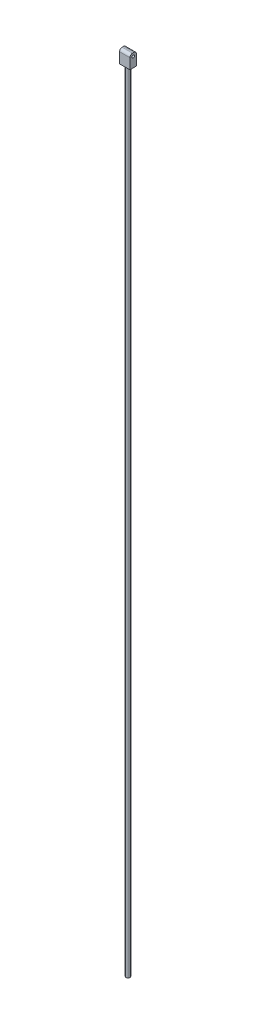
ISO-10303-21;
HEADER;
FILE_DESCRIPTION(('STEP AP214'),'2;1');
FILE_NAME('part.step','',(''),(''),'','','');
FILE_SCHEMA(('AUTOMOTIVE_DESIGN { 1 0 10303 214 1 1 1 1 }'));
ENDSEC;
DATA;
#1=APPLICATION_CONTEXT('core data for automotive mechanical design processes');
#2=APPLICATION_PROTOCOL_DEFINITION('international standard','automotive_design',2000,#1);
#3=PRODUCT_CONTEXT('',#1,'mechanical');
#4=PRODUCT('Part','Part','',(#3));
#5=PRODUCT_RELATED_PRODUCT_CATEGORY('part','',(#4));
#6=PRODUCT_DEFINITION_FORMATION('','',#4);
#7=PRODUCT_DEFINITION_CONTEXT('part definition',#1,'design');
#8=PRODUCT_DEFINITION('design','',#6,#7);
#9=PRODUCT_DEFINITION_SHAPE('','',#8);
#10=(LENGTH_UNIT() NAMED_UNIT(*) SI_UNIT(.MILLI.,.METRE.));
#11=(NAMED_UNIT(*) PLANE_ANGLE_UNIT() SI_UNIT($,.RADIAN.));
#12=(NAMED_UNIT(*) SI_UNIT($,.STERADIAN.) SOLID_ANGLE_UNIT());
#13=UNCERTAINTY_MEASURE_WITH_UNIT(LENGTH_MEASURE(1.E-05),#10,'distance_accuracy_value','');
#14=(GEOMETRIC_REPRESENTATION_CONTEXT(3) GLOBAL_UNCERTAINTY_ASSIGNED_CONTEXT((#13)) GLOBAL_UNIT_ASSIGNED_CONTEXT((#10,
#11,#12)) REPRESENTATION_CONTEXT('',''));
#15=CARTESIAN_POINT('',(0.,0.,0.));
#16=DIRECTION('',(0.,0.,1.));
#17=DIRECTION('',(1.,0.,0.));
#18=AXIS2_PLACEMENT_3D('',#15,#16,#17);
#19=CARTESIAN_POINT('',(-3.95,-5.,2.5));
#20=DIRECTION('',(0.,1.,0.));
#21=DIRECTION('',(0.,0.,1.));
#22=AXIS2_PLACEMENT_3D('',#19,#20,#21);
#23=PLANE('',#22);
#24=DIRECTION('',(1.,0.,0.));
#25=VECTOR('',#24,1.);
#26=CARTESIAN_POINT('',(-3.95,-5.,-2.5));
#27=LINE('',#26,#25);
#28=CARTESIAN_POINT('',(-3.95,-5.,-2.5));
#29=VERTEX_POINT('',#28);
#30=CARTESIAN_POINT('',(3.95,-5.,-2.5));
#31=VERTEX_POINT('',#30);
#32=EDGE_CURVE('E115',#29,#31,#27,.T.);
#33=ORIENTED_EDGE('',*,*,#32,.T.);
#34=DIRECTION('',(0.,0.,-1.));
#35=VECTOR('',#34,1.);
#36=CARTESIAN_POINT('',(3.95,-5.,2.5));
#37=LINE('',#36,#35);
#38=CARTESIAN_POINT('',(3.95,-5.,2.5));
#39=VERTEX_POINT('',#38);
#40=EDGE_CURVE('E101',#39,#31,#37,.T.);
#41=ORIENTED_EDGE('',*,*,#40,.F.);
#42=DIRECTION('',(1.,0.,0.));
#43=VECTOR('',#42,1.);
#44=CARTESIAN_POINT('',(-3.95,-5.,2.5));
#45=LINE('',#44,#43);
#46=CARTESIAN_POINT('',(-3.95,-5.,2.5));
#47=VERTEX_POINT('',#46);
#48=EDGE_CURVE('E88',#47,#39,#45,.T.);
#49=ORIENTED_EDGE('',*,*,#48,.F.);
#50=DIRECTION('',(0.,0.,-1.));
#51=VECTOR('',#50,1.);
#52=CARTESIAN_POINT('',(-3.95,-5.,2.5));
#53=LINE('',#52,#51);
#54=EDGE_CURVE('E94',#47,#29,#53,.T.);
#55=ORIENTED_EDGE('',*,*,#54,.T.);
#56=EDGE_LOOP('',(#33,#41,#49,#55));
#57=FACE_BOUND('',#56,.T.);
#58=CARTESIAN_POINT('',(0.,-5.,0.));
#59=DIRECTION('',(0.,1.,0.));
#60=DIRECTION('',(0.,0.,1.));
#61=AXIS2_PLACEMENT_3D('',#58,#59,#60);
#62=CIRCLE('',#61,1.5);
#63=CARTESIAN_POINT('',(0.,-5.,1.5));
#64=VERTEX_POINT('',#63);
#65=EDGE_CURVE('E11',#64,#64,#62,.F.);
#66=ORIENTED_EDGE('',*,*,#65,.F.);
#67=EDGE_LOOP('',(#66));
#68=FACE_BOUND('',#67,.T.);
#69=ADVANCED_FACE('F32',(#57,#68),#23,.F.);
#70=CARTESIAN_POINT('',(0.,3.,0.5));
#71=DIRECTION('',(1.,0.,0.));
#72=DIRECTION('',(0.,0.,-1.));
#73=AXIS2_PLACEMENT_3D('',#70,#71,#72);
#74=CYLINDRICAL_SURFACE('',#73,2.);
#75=DIRECTION('',(-1.,0.,0.));
#76=VECTOR('',#75,1.);
#77=CARTESIAN_POINT('',(0.,3.,2.5));
#78=LINE('',#77,#76);
#79=CARTESIAN_POINT('',(3.95,3.,2.5));
#80=VERTEX_POINT('',#79);
#81=CARTESIAN_POINT('',(-3.95,3.,2.5));
#82=VERTEX_POINT('',#81);
#83=EDGE_CURVE('E90',#80,#82,#78,.T.);
#84=ORIENTED_EDGE('',*,*,#83,.F.);
#85=CARTESIAN_POINT('',(3.95,3.,0.5));
#86=DIRECTION('',(-1.,0.,0.));
#87=DIRECTION('',(0.,-1.,0.));
#88=AXIS2_PLACEMENT_3D('',#85,#86,#87);
#89=CIRCLE('',#88,2.);
#90=CARTESIAN_POINT('',(3.95,5.,0.5));
#91=VERTEX_POINT('',#90);
#92=EDGE_CURVE('E53',#91,#80,#89,.F.);
#93=ORIENTED_EDGE('',*,*,#92,.F.);
#94=DIRECTION('',(-1.,0.,0.));
#95=VECTOR('',#94,1.);
#96=CARTESIAN_POINT('',(0.,5.,0.5));
#97=LINE('',#96,#95);
#98=CARTESIAN_POINT('',(-3.95,5.,0.5));
#99=VERTEX_POINT('',#98);
#100=EDGE_CURVE('E132',#99,#91,#97,.F.);
#101=ORIENTED_EDGE('',*,*,#100,.F.);
#102=CARTESIAN_POINT('',(-3.95,3.,0.5));
#103=DIRECTION('',(1.,0.,0.));
#104=DIRECTION('',(0.,1.,0.));
#105=AXIS2_PLACEMENT_3D('',#102,#103,#104);
#106=CIRCLE('',#105,2.);
#107=EDGE_CURVE('E40',#82,#99,#106,.F.);
#108=ORIENTED_EDGE('',*,*,#107,.F.);
#109=EDGE_LOOP('',(#84,#93,#101,#108));
#110=FACE_BOUND('',#109,.T.);
#111=ADVANCED_FACE('F34',(#110),#74,.T.);
#112=CARTESIAN_POINT('',(0.,3.,-0.5));
#113=DIRECTION('',(1.,0.,0.));
#114=DIRECTION('',(0.,0.,-1.));
#115=AXIS2_PLACEMENT_3D('',#112,#113,#114);
#116=CYLINDRICAL_SURFACE('',#115,2.);
#117=DIRECTION('',(1.,0.,0.));
#118=VECTOR('',#117,1.);
#119=CARTESIAN_POINT('',(0.,3.,-2.5));
#120=LINE('',#119,#118);
#121=CARTESIAN_POINT('',(-3.95,3.,-2.5));
#122=VERTEX_POINT('',#121);
#123=CARTESIAN_POINT('',(3.95,3.,-2.5));
#124=VERTEX_POINT('',#123);
#125=EDGE_CURVE('E120',#122,#124,#120,.T.);
#126=ORIENTED_EDGE('',*,*,#125,.F.);
#127=CARTESIAN_POINT('',(-3.95,3.,-0.5));
#128=DIRECTION('',(1.,0.,0.));
#129=DIRECTION('',(0.,1.,0.));
#130=AXIS2_PLACEMENT_3D('',#127,#128,#129);
#131=CIRCLE('',#130,2.);
#132=CARTESIAN_POINT('',(-3.95,5.,-0.5));
#133=VERTEX_POINT('',#132);
#134=EDGE_CURVE('E126',#133,#122,#131,.F.);
#135=ORIENTED_EDGE('',*,*,#134,.F.);
#136=DIRECTION('',(1.,0.,0.));
#137=VECTOR('',#136,1.);
#138=CARTESIAN_POINT('',(-3.95,5.,-0.5));
#139=LINE('',#138,#137);
#140=CARTESIAN_POINT('',(3.95,5.,-0.5));
#141=VERTEX_POINT('',#140);
#142=EDGE_CURVE('E123',#141,#133,#139,.F.);
#143=ORIENTED_EDGE('',*,*,#142,.F.);
#144=CARTESIAN_POINT('',(3.95,3.,-0.5));
#145=DIRECTION('',(-1.,0.,0.));
#146=DIRECTION('',(0.,-1.,0.));
#147=AXIS2_PLACEMENT_3D('',#144,#145,#146);
#148=CIRCLE('',#147,2.);
#149=EDGE_CURVE('E128',#124,#141,#148,.F.);
#150=ORIENTED_EDGE('',*,*,#149,.F.);
#151=EDGE_LOOP('',(#126,#135,#143,#150));
#152=FACE_BOUND('',#151,.T.);
#153=ADVANCED_FACE('F157',(#152),#116,.T.);
#154=CARTESIAN_POINT('',(3.95,5.,2.5));
#155=DIRECTION('',(-1.,0.,0.));
#156=DIRECTION('',(0.,-1.,0.));
#157=AXIS2_PLACEMENT_3D('',#154,#155,#156);
#158=PLANE('',#157);
#159=CARTESIAN_POINT('',(3.95,2.5,0.));
#160=DIRECTION('',(1.,0.,0.));
#161=DIRECTION('',(0.,1.,0.));
#162=AXIS2_PLACEMENT_3D('',#159,#160,#161);
#163=CIRCLE('',#162,1.);
#164=CARTESIAN_POINT('',(3.95,3.5,0.));
#165=VERTEX_POINT('',#164);
#166=EDGE_CURVE('E136',#165,#165,#163,.T.);
#167=ORIENTED_EDGE('',*,*,#166,.F.);
#168=EDGE_LOOP('',(#167));
#169=FACE_BOUND('',#168,.T.);
#170=DIRECTION('',(0.,0.,-1.));
#171=VECTOR('',#170,1.);
#172=CARTESIAN_POINT('',(3.95,5.,2.5));
#173=LINE('',#172,#171);
#174=EDGE_CURVE('E118',#91,#141,#173,.T.);
#175=ORIENTED_EDGE('',*,*,#174,.F.);
#176=ORIENTED_EDGE('',*,*,#92,.T.);
#177=DIRECTION('',(0.,1.,0.));
#178=VECTOR('',#177,1.);
#179=CARTESIAN_POINT('',(3.95,5.,2.5));
#180=LINE('',#179,#178);
#181=EDGE_CURVE('E91',#39,#80,#180,.T.);
#182=ORIENTED_EDGE('',*,*,#181,.F.);
#183=ORIENTED_EDGE('',*,*,#40,.T.);
#184=DIRECTION('',(0.,1.,0.));
#185=VECTOR('',#184,1.);
#186=CARTESIAN_POINT('',(3.95,5.,-2.5));
#187=LINE('',#186,#185);
#188=EDGE_CURVE('E110',#31,#124,#187,.T.);
#189=ORIENTED_EDGE('',*,*,#188,.T.);
#190=ORIENTED_EDGE('',*,*,#149,.T.);
#191=EDGE_LOOP('',(#175,#176,#182,#183,#189,#190));
#192=FACE_BOUND('',#191,.T.);
#193=ADVANCED_FACE('F148',(#169,#192),#158,.F.);
#194=CARTESIAN_POINT('',(-3.95,5.,2.5));
#195=DIRECTION('',(0.,-1.,0.));
#196=DIRECTION('',(0.,0.,-1.));
#197=AXIS2_PLACEMENT_3D('',#194,#195,#196);
#198=PLANE('',#197);
#199=DIRECTION('',(0.,0.,-1.));
#200=VECTOR('',#199,1.);
#201=CARTESIAN_POINT('',(-3.95,5.,2.5));
#202=LINE('',#201,#200);
#203=EDGE_CURVE('E100',#99,#133,#202,.T.);
#204=ORIENTED_EDGE('',*,*,#203,.F.);
#205=ORIENTED_EDGE('',*,*,#100,.T.);
#206=ORIENTED_EDGE('',*,*,#174,.T.);
#207=ORIENTED_EDGE('',*,*,#142,.T.);
#208=EDGE_LOOP('',(#204,#205,#206,#207));
#209=FACE_BOUND('',#208,.T.);
#210=ADVANCED_FACE('F152',(#209),#198,.F.);
#211=CARTESIAN_POINT('',(-3.95,5.,2.5));
#212=DIRECTION('',(1.,0.,0.));
#213=DIRECTION('',(0.,1.,0.));
#214=AXIS2_PLACEMENT_3D('',#211,#212,#213);
#215=PLANE('',#214);
#216=CARTESIAN_POINT('',(-3.95,2.5,0.));
#217=DIRECTION('',(1.,0.,0.));
#218=DIRECTION('',(0.,1.,0.));
#219=AXIS2_PLACEMENT_3D('',#216,#217,#218);
#220=CIRCLE('',#219,1.);
#221=CARTESIAN_POINT('',(-3.95,3.5,0.));
#222=VERTEX_POINT('',#221);
#223=EDGE_CURVE('E113',#222,#222,#220,.T.);
#224=ORIENTED_EDGE('',*,*,#223,.T.);
#225=EDGE_LOOP('',(#224));
#226=FACE_BOUND('',#225,.T.);
#227=DIRECTION('',(0.,-1.,0.));
#228=VECTOR('',#227,1.);
#229=CARTESIAN_POINT('',(-3.95,5.,2.5));
#230=LINE('',#229,#228);
#231=EDGE_CURVE('E83',#82,#47,#230,.T.);
#232=ORIENTED_EDGE('',*,*,#231,.F.);
#233=ORIENTED_EDGE('',*,*,#107,.T.);
#234=ORIENTED_EDGE('',*,*,#203,.T.);
#235=ORIENTED_EDGE('',*,*,#134,.T.);
#236=DIRECTION('',(0.,-1.,0.));
#237=VECTOR('',#236,1.);
#238=CARTESIAN_POINT('',(-3.95,5.,-2.5));
#239=LINE('',#238,#237);
#240=EDGE_CURVE('E97',#122,#29,#239,.T.);
#241=ORIENTED_EDGE('',*,*,#240,.T.);
#242=ORIENTED_EDGE('',*,*,#54,.F.);
#243=EDGE_LOOP('',(#232,#233,#234,#235,#241,#242));
#244=FACE_BOUND('',#243,.T.);
#245=ADVANCED_FACE('F95',(#226,#244),#215,.F.);
#246=CARTESIAN_POINT('',(0.,0.,2.5));
#247=DIRECTION('',(0.,0.,1.));
#248=DIRECTION('',(1.,0.,0.));
#249=AXIS2_PLACEMENT_3D('',#246,#247,#248);
#250=PLANE('',#249);
#251=ORIENTED_EDGE('',*,*,#181,.T.);
#252=ORIENTED_EDGE('',*,*,#83,.T.);
#253=ORIENTED_EDGE('',*,*,#231,.T.);
#254=ORIENTED_EDGE('',*,*,#48,.T.);
#255=EDGE_LOOP('',(#251,#252,#253,#254));
#256=FACE_BOUND('',#255,.T.);
#257=ADVANCED_FACE('F86',(#256),#250,.T.);
#258=CARTESIAN_POINT('',(0.,0.,-2.5));
#259=DIRECTION('',(0.,0.,1.));
#260=DIRECTION('',(1.,0.,0.));
#261=AXIS2_PLACEMENT_3D('',#258,#259,#260);
#262=PLANE('',#261);
#263=ORIENTED_EDGE('',*,*,#240,.F.);
#264=ORIENTED_EDGE('',*,*,#125,.T.);
#265=ORIENTED_EDGE('',*,*,#188,.F.);
#266=ORIENTED_EDGE('',*,*,#32,.F.);
#267=EDGE_LOOP('',(#263,#264,#265,#266));
#268=FACE_BOUND('',#267,.T.);
#269=ADVANCED_FACE('F159',(#268),#262,.F.);
#270=CARTESIAN_POINT('',(-6.05,2.5,0.));
#271=DIRECTION('',(1.,0.,0.));
#272=DIRECTION('',(0.,1.,0.));
#273=AXIS2_PLACEMENT_3D('',#270,#271,#272);
#274=CYLINDRICAL_SURFACE('',#273,1.);
#275=ORIENTED_EDGE('',*,*,#166,.T.);
#276=EDGE_LOOP('',(#275));
#277=FACE_BOUND('',#276,.T.);
#278=ORIENTED_EDGE('',*,*,#223,.F.);
#279=EDGE_LOOP('',(#278));
#280=FACE_BOUND('',#279,.T.);
#281=ADVANCED_FACE('F161',(#277,#280),#274,.F.);
#282=CARTESIAN_POINT('',(0.,-605.,0.));
#283=DIRECTION('',(0.,1.,0.));
#284=DIRECTION('',(0.,0.,1.));
#285=AXIS2_PLACEMENT_3D('',#282,#283,#284);
#286=CYLINDRICAL_SURFACE('',#285,1.5);
#287=CARTESIAN_POINT('',(0.,-605.,0.));
#288=DIRECTION('',(0.,-1.,0.));
#289=DIRECTION('',(0.,0.,-1.));
#290=AXIS2_PLACEMENT_3D('',#287,#288,#289);
#291=CIRCLE('',#290,1.5);
#292=CARTESIAN_POINT('',(0.,-605.,-1.5));
#293=VERTEX_POINT('',#292);
#294=EDGE_CURVE('E140',#293,#293,#291,.T.);
#295=ORIENTED_EDGE('',*,*,#294,.F.);
#296=EDGE_LOOP('',(#295));
#297=FACE_BOUND('',#296,.T.);
#298=ORIENTED_EDGE('',*,*,#65,.T.);
#299=EDGE_LOOP('',(#298));
#300=FACE_BOUND('',#299,.T.);
#301=ADVANCED_FACE('F167',(#297,#300),#286,.T.);
#302=CARTESIAN_POINT('',(0.,-605.,0.));
#303=DIRECTION('',(0.,-1.,0.));
#304=DIRECTION('',(0.,0.,-1.));
#305=AXIS2_PLACEMENT_3D('',#302,#303,#304);
#306=PLANE('',#305);
#307=ORIENTED_EDGE('',*,*,#294,.T.);
#308=EDGE_LOOP('',(#307));
#309=FACE_BOUND('',#308,.T.);
#310=ADVANCED_FACE('F234',(#309),#306,.T.);
#311=CLOSED_SHELL('',(#69,#111,#153,#193,#210,#245,#257,#269,#281,#301,#310));
#312=MANIFOLD_SOLID_BREP('B2',#311);
#313=ADVANCED_BREP_SHAPE_REPRESENTATION('',(#18,#312),#14);
#314=SHAPE_DEFINITION_REPRESENTATION(#9,#313);
ENDSEC;
END-ISO-10303-21;
